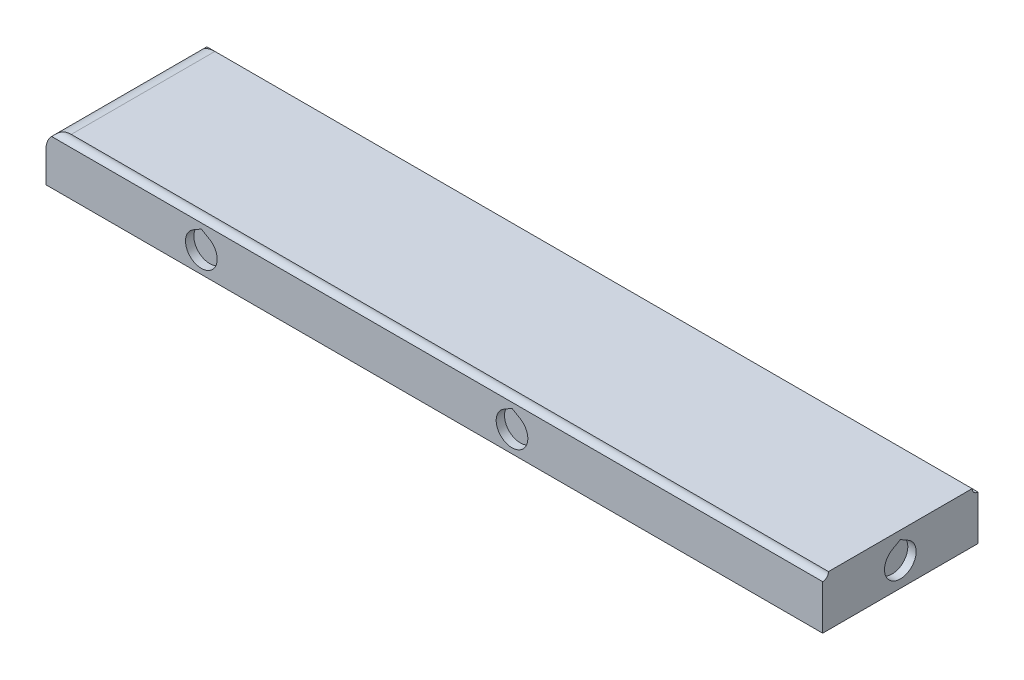
ISO-10303-21;
HEADER;
FILE_DESCRIPTION(('STEP AP214'),'2;1');
FILE_NAME('part.step','',(''),(''),'','','');
FILE_SCHEMA(('AUTOMOTIVE_DESIGN { 1 0 10303 214 1 1 1 1 }'));
ENDSEC;
DATA;
#1=APPLICATION_CONTEXT('core data for automotive mechanical design processes');
#2=APPLICATION_PROTOCOL_DEFINITION('international standard','automotive_design',2000,#1);
#3=PRODUCT_CONTEXT('',#1,'mechanical');
#4=PRODUCT('Part','Part','',(#3));
#5=PRODUCT_RELATED_PRODUCT_CATEGORY('part','',(#4));
#6=PRODUCT_DEFINITION_FORMATION('','',#4);
#7=PRODUCT_DEFINITION_CONTEXT('part definition',#1,'design');
#8=PRODUCT_DEFINITION('design','',#6,#7);
#9=PRODUCT_DEFINITION_SHAPE('','',#8);
#10=(LENGTH_UNIT() NAMED_UNIT(*) SI_UNIT(.MILLI.,.METRE.));
#11=(NAMED_UNIT(*) PLANE_ANGLE_UNIT() SI_UNIT($,.RADIAN.));
#12=(NAMED_UNIT(*) SI_UNIT($,.STERADIAN.) SOLID_ANGLE_UNIT());
#13=UNCERTAINTY_MEASURE_WITH_UNIT(LENGTH_MEASURE(1.E-05),#10,'distance_accuracy_value','');
#14=(GEOMETRIC_REPRESENTATION_CONTEXT(3) GLOBAL_UNCERTAINTY_ASSIGNED_CONTEXT((#13)) GLOBAL_UNIT_ASSIGNED_CONTEXT((#10,
#11,#12)) REPRESENTATION_CONTEXT('',''));
#15=CARTESIAN_POINT('',(0.,0.,0.));
#16=DIRECTION('',(0.,0.,1.));
#17=DIRECTION('',(1.,0.,0.));
#18=AXIS2_PLACEMENT_3D('',#15,#16,#17);
#19=CARTESIAN_POINT('',(100.,-13.,20.));
#20=DIRECTION('',(1.,0.,0.));
#21=DIRECTION('',(0.,0.,-1.));
#22=AXIS2_PLACEMENT_3D('',#19,#20,#21);
#23=PLANE('',#22);
#24=DIRECTION('',(0.,1.,0.));
#25=VECTOR('',#24,1.);
#26=CARTESIAN_POINT('',(100.,-13.,-20.));
#27=LINE('',#26,#25);
#28=CARTESIAN_POINT('',(100.,-13.,-20.));
#29=VERTEX_POINT('',#28);
#30=CARTESIAN_POINT('',(100.,-1.5,-20.));
#31=VERTEX_POINT('',#30);
#32=EDGE_CURVE('E342',#29,#31,#27,.T.);
#33=ORIENTED_EDGE('',*,*,#32,.T.);
#34=CARTESIAN_POINT('',(100.,0.,-20.));
#35=DIRECTION('',(1.,0.,0.));
#36=DIRECTION('',(0.,0.,-1.));
#37=AXIS2_PLACEMENT_3D('',#34,#35,#36);
#38=CIRCLE('',#37,1.5);
#39=CARTESIAN_POINT('',(100.,0.,-18.5));
#40=VERTEX_POINT('',#39);
#41=EDGE_CURVE('E309',#31,#40,#38,.F.);
#42=ORIENTED_EDGE('',*,*,#41,.T.);
#43=DIRECTION('',(0.,0.,-1.));
#44=VECTOR('',#43,1.);
#45=CARTESIAN_POINT('',(100.,0.,20.));
#46=LINE('',#45,#44);
#47=CARTESIAN_POINT('',(100.,0.,18.5));
#48=VERTEX_POINT('',#47);
#49=EDGE_CURVE('E323',#48,#40,#46,.T.);
#50=ORIENTED_EDGE('',*,*,#49,.F.);
#51=CARTESIAN_POINT('',(100.,0.,20.));
#52=DIRECTION('',(1.,0.,0.));
#53=DIRECTION('',(0.,0.,-1.));
#54=AXIS2_PLACEMENT_3D('',#51,#52,#53);
#55=CIRCLE('',#54,1.5);
#56=CARTESIAN_POINT('',(100.,-1.5,20.));
#57=VERTEX_POINT('',#56);
#58=EDGE_CURVE('E318',#48,#57,#55,.F.);
#59=ORIENTED_EDGE('',*,*,#58,.T.);
#60=DIRECTION('',(0.,1.,0.));
#61=VECTOR('',#60,1.);
#62=CARTESIAN_POINT('',(100.,-13.,20.));
#63=LINE('',#62,#61);
#64=CARTESIAN_POINT('',(100.,-13.,20.));
#65=VERTEX_POINT('',#64);
#66=EDGE_CURVE('E345',#65,#57,#63,.T.);
#67=ORIENTED_EDGE('',*,*,#66,.F.);
#68=DIRECTION('',(0.,0.,-1.));
#69=VECTOR('',#68,1.);
#70=CARTESIAN_POINT('',(100.,-13.,20.));
#71=LINE('',#70,#69);
#72=EDGE_CURVE('E330',#65,#29,#71,.T.);
#73=ORIENTED_EDGE('',*,*,#72,.T.);
#74=EDGE_LOOP('',(#33,#42,#50,#59,#67,#73));
#75=FACE_BOUND('',#74,.T.);
#76=DIRECTION('',(0.,-0.499999999999997,-0.86602540378444));
#77=VECTOR('',#76,1.);
#78=CARTESIAN_POINT('',(100.,-1.58234823978922,0.913569182194027));
#79=LINE('',#78,#77);
#80=CARTESIAN_POINT('',(100.,-2.10979765305228,0.));
#81=VERTEX_POINT('',#80);
#82=CARTESIAN_POINT('',(100.,-3.28614882652613,-2.03749999999999));
#83=VERTEX_POINT('',#82);
#84=EDGE_CURVE('E216',#81,#83,#79,.T.);
#85=ORIENTED_EDGE('',*,*,#84,.T.);
#86=CARTESIAN_POINT('',(100.,-6.81520234694772,0.));
#87=DIRECTION('',(1.,0.,0.));
#88=DIRECTION('',(0.,0.,-1.));
#89=AXIS2_PLACEMENT_3D('',#86,#87,#88);
#90=CIRCLE('',#89,4.075);
#91=CARTESIAN_POINT('',(100.,-3.28614882652613,2.03749999999999));
#92=VERTEX_POINT('',#91);
#93=EDGE_CURVE('E210',#83,#92,#90,.F.);
#94=ORIENTED_EDGE('',*,*,#93,.T.);
#95=DIRECTION('',(0.,-0.499999999999998,0.86602540378444));
#96=VECTOR('',#95,1.);
#97=CARTESIAN_POINT('',(100.,-1.58234823978921,-0.913569182194028));
#98=LINE('',#97,#96);
#99=EDGE_CURVE('E213',#81,#92,#98,.T.);
#100=ORIENTED_EDGE('',*,*,#99,.F.);
#101=EDGE_LOOP('',(#85,#94,#100));
#102=FACE_BOUND('',#101,.T.);
#103=ADVANCED_FACE('F37',(#75,#102),#23,.T.);
#104=CARTESIAN_POINT('',(-100.,-13.,20.));
#105=DIRECTION('',(-1.,0.,0.));
#106=DIRECTION('',(0.,0.,1.));
#107=AXIS2_PLACEMENT_3D('',#104,#105,#106);
#108=PLANE('',#107);
#109=DIRECTION('',(0.,1.,0.));
#110=VECTOR('',#109,1.);
#111=CARTESIAN_POINT('',(-100.,-13.,20.));
#112=LINE('',#111,#110);
#113=CARTESIAN_POINT('',(-100.,-13.,20.));
#114=VERTEX_POINT('',#113);
#115=CARTESIAN_POINT('',(-100.,-5.,20.));
#116=VERTEX_POINT('',#115);
#117=EDGE_CURVE('E336',#114,#116,#112,.T.);
#118=ORIENTED_EDGE('',*,*,#117,.T.);
#119=DIRECTION('',(0.,0.,1.));
#120=VECTOR('',#119,1.);
#121=CARTESIAN_POINT('',(-100.,-5.,-18.5));
#122=LINE('',#121,#120);
#123=CARTESIAN_POINT('',(-100.,-5.,-20.));
#124=VERTEX_POINT('',#123);
#125=EDGE_CURVE('E65',#116,#124,#122,.F.);
#126=ORIENTED_EDGE('',*,*,#125,.T.);
#127=DIRECTION('',(0.,1.,0.));
#128=VECTOR('',#127,1.);
#129=CARTESIAN_POINT('',(-100.,-13.,-20.));
#130=LINE('',#129,#128);
#131=CARTESIAN_POINT('',(-100.,-13.,-20.));
#132=VERTEX_POINT('',#131);
#133=EDGE_CURVE('E339',#132,#124,#130,.T.);
#134=ORIENTED_EDGE('',*,*,#133,.F.);
#135=DIRECTION('',(0.,0.,1.));
#136=VECTOR('',#135,1.);
#137=CARTESIAN_POINT('',(-100.,-13.,20.));
#138=LINE('',#137,#136);
#139=EDGE_CURVE('E324',#132,#114,#138,.T.);
#140=ORIENTED_EDGE('',*,*,#139,.T.);
#141=EDGE_LOOP('',(#118,#126,#134,#140));
#142=FACE_BOUND('',#141,.T.);
#143=ADVANCED_FACE('F385',(#142),#108,.T.);
#144=CARTESIAN_POINT('',(-100.,-13.,-20.));
#145=DIRECTION('',(0.,0.,-1.));
#146=DIRECTION('',(-1.,0.,0.));
#147=AXIS2_PLACEMENT_3D('',#144,#145,#146);
#148=PLANE('',#147);
#149=CARTESIAN_POINT('',(-20.,-7.56520234694773,-20.));
#150=DIRECTION('',(0.,0.,-1.));
#151=DIRECTION('',(-1.,0.,0.));
#152=AXIS2_PLACEMENT_3D('',#149,#150,#151);
#153=CIRCLE('',#152,4.075);
#154=CARTESIAN_POINT('',(-17.9625,-4.03614882652614,-20.));
#155=VERTEX_POINT('',#154);
#156=CARTESIAN_POINT('',(-22.0375,-4.03614882652612,-20.));
#157=VERTEX_POINT('',#156);
#158=EDGE_CURVE('E245',#155,#157,#153,.T.);
#159=ORIENTED_EDGE('',*,*,#158,.F.);
#160=DIRECTION('',(-0.86602540378444,0.499999999999999,0.));
#161=VECTOR('',#160,1.);
#162=CARTESIAN_POINT('',(-66.2383287086133,23.8359138737439,-20.));
#163=LINE('',#162,#161);
#164=CARTESIAN_POINT('',(-20.,-2.85979765305229,-20.));
#165=VERTEX_POINT('',#164);
#166=EDGE_CURVE('E274',#155,#165,#163,.T.);
#167=ORIENTED_EDGE('',*,*,#166,.T.);
#168=DIRECTION('',(-0.866025403784441,-0.499999999999997,0.));
#169=VECTOR('',#168,1.);
#170=CARTESIAN_POINT('',(-63.761671291387,-28.1256103533223,-20.));
#171=LINE('',#170,#169);
#172=EDGE_CURVE('E280',#165,#157,#171,.T.);
#173=ORIENTED_EDGE('',*,*,#172,.T.);
#174=EDGE_LOOP('',(#159,#167,#173));
#175=FACE_BOUND('',#174,.T.);
#176=CARTESIAN_POINT('',(60.,-7.56520234694773,-20.));
#177=DIRECTION('',(0.,0.,-1.));
#178=DIRECTION('',(-1.,0.,0.));
#179=AXIS2_PLACEMENT_3D('',#176,#177,#178);
#180=CIRCLE('',#179,4.075);
#181=CARTESIAN_POINT('',(62.0375,-4.03614882652614,-20.));
#182=VERTEX_POINT('',#181);
#183=CARTESIAN_POINT('',(57.9625,-4.03614882652613,-20.));
#184=VERTEX_POINT('',#183);
#185=EDGE_CURVE('E287',#182,#184,#180,.T.);
#186=ORIENTED_EDGE('',*,*,#185,.F.);
#187=DIRECTION('',(-0.86602540378444,0.499999999999999,0.));
#188=VECTOR('',#187,1.);
#189=CARTESIAN_POINT('',(13.7616712913867,23.8359138737439,-20.));
#190=LINE('',#189,#188);
#191=CARTESIAN_POINT('',(60.,-2.85979765305229,-20.));
#192=VERTEX_POINT('',#191);
#193=EDGE_CURVE('E296',#182,#192,#190,.T.);
#194=ORIENTED_EDGE('',*,*,#193,.T.);
#195=DIRECTION('',(-0.866025403784441,-0.499999999999997,0.));
#196=VECTOR('',#195,1.);
#197=CARTESIAN_POINT('',(16.238328708613,-28.1256103533223,-20.));
#198=LINE('',#197,#196);
#199=EDGE_CURVE('E302',#192,#184,#198,.T.);
#200=ORIENTED_EDGE('',*,*,#199,.T.);
#201=EDGE_LOOP('',(#186,#194,#200));
#202=FACE_BOUND('',#201,.T.);
#203=ORIENTED_EDGE('',*,*,#133,.T.);
#204=CARTESIAN_POINT('',(-95.,-5.,-20.));
#205=DIRECTION('',(0.,0.,-1.));
#206=DIRECTION('',(-1.,0.,0.));
#207=AXIS2_PLACEMENT_3D('',#204,#205,#206);
#208=CIRCLE('',#207,5.);
#209=CARTESIAN_POINT('',(-98.5707142142714,-1.5,-20.));
#210=VERTEX_POINT('',#209);
#211=EDGE_CURVE('E51',#124,#210,#208,.T.);
#212=ORIENTED_EDGE('',*,*,#211,.T.);
#213=DIRECTION('',(-1.,0.,0.));
#214=VECTOR('',#213,1.);
#215=CARTESIAN_POINT('',(104.,-1.5,-20.));
#216=LINE('',#215,#214);
#217=EDGE_CURVE('E316',#31,#210,#216,.T.);
#218=ORIENTED_EDGE('',*,*,#217,.F.);
#219=ORIENTED_EDGE('',*,*,#32,.F.);
#220=DIRECTION('',(-1.,0.,0.));
#221=VECTOR('',#220,1.);
#222=CARTESIAN_POINT('',(-100.,-13.,-20.));
#223=LINE('',#222,#221);
#224=EDGE_CURVE('E333',#29,#132,#223,.T.);
#225=ORIENTED_EDGE('',*,*,#224,.T.);
#226=EDGE_LOOP('',(#203,#212,#218,#219,#225));
#227=FACE_BOUND('',#226,.T.);
#228=ADVANCED_FACE('F382',(#175,#202,#227),#148,.T.);
#229=CARTESIAN_POINT('',(-100.,-13.,20.));
#230=DIRECTION('',(0.,0.,1.));
#231=DIRECTION('',(1.,0.,0.));
#232=AXIS2_PLACEMENT_3D('',#229,#230,#231);
#233=PLANE('',#232);
#234=CARTESIAN_POINT('',(-60.,-7.56520234694773,20.));
#235=DIRECTION('',(0.,0.,1.));
#236=DIRECTION('',(1.,0.,0.));
#237=AXIS2_PLACEMENT_3D('',#234,#235,#236);
#238=CIRCLE('',#237,4.075);
#239=CARTESIAN_POINT('',(-62.0375,-4.03614882652614,20.));
#240=VERTEX_POINT('',#239);
#241=CARTESIAN_POINT('',(-57.9625,-4.03614882652613,20.));
#242=VERTEX_POINT('',#241);
#243=EDGE_CURVE('E235',#240,#242,#238,.T.);
#244=ORIENTED_EDGE('',*,*,#243,.F.);
#245=DIRECTION('',(0.86602540378444,0.499999999999999,0.));
#246=VECTOR('',#245,1.);
#247=CARTESIAN_POINT('',(-13.7616712913867,23.8359138737439,20.));
#248=LINE('',#247,#246);
#249=CARTESIAN_POINT('',(-60.,-2.85979765305229,20.));
#250=VERTEX_POINT('',#249);
#251=EDGE_CURVE('E230',#240,#250,#248,.T.);
#252=ORIENTED_EDGE('',*,*,#251,.T.);
#253=DIRECTION('',(0.866025403784441,-0.499999999999997,0.));
#254=VECTOR('',#253,1.);
#255=CARTESIAN_POINT('',(-16.238328708613,-28.1256103533223,20.));
#256=LINE('',#255,#254);
#257=EDGE_CURVE('E237',#250,#242,#256,.T.);
#258=ORIENTED_EDGE('',*,*,#257,.T.);
#259=EDGE_LOOP('',(#244,#252,#258));
#260=FACE_BOUND('',#259,.T.);
#261=CARTESIAN_POINT('',(20.,-7.56520234694773,20.));
#262=DIRECTION('',(0.,0.,1.));
#263=DIRECTION('',(1.,0.,0.));
#264=AXIS2_PLACEMENT_3D('',#261,#262,#263);
#265=CIRCLE('',#264,4.075);
#266=CARTESIAN_POINT('',(17.9625,-4.03614882652614,20.));
#267=VERTEX_POINT('',#266);
#268=CARTESIAN_POINT('',(22.0375,-4.03614882652614,20.));
#269=VERTEX_POINT('',#268);
#270=EDGE_CURVE('E224',#267,#269,#265,.T.);
#271=ORIENTED_EDGE('',*,*,#270,.F.);
#272=DIRECTION('',(0.86602540378444,0.499999999999999,0.));
#273=VECTOR('',#272,1.);
#274=CARTESIAN_POINT('',(66.2383287086133,23.8359138737439,20.));
#275=LINE('',#274,#273);
#276=CARTESIAN_POINT('',(20.,-2.85979765305229,20.));
#277=VERTEX_POINT('',#276);
#278=EDGE_CURVE('E254',#267,#277,#275,.T.);
#279=ORIENTED_EDGE('',*,*,#278,.T.);
#280=DIRECTION('',(0.866025403784441,-0.499999999999997,0.));
#281=VECTOR('',#280,1.);
#282=CARTESIAN_POINT('',(63.761671291387,-28.1256103533223,20.));
#283=LINE('',#282,#281);
#284=EDGE_CURVE('E260',#277,#269,#283,.T.);
#285=ORIENTED_EDGE('',*,*,#284,.T.);
#286=EDGE_LOOP('',(#271,#279,#285));
#287=FACE_BOUND('',#286,.T.);
#288=DIRECTION('',(1.,0.,0.));
#289=VECTOR('',#288,1.);
#290=CARTESIAN_POINT('',(-105.,-1.5,20.));
#291=LINE('',#290,#289);
#292=CARTESIAN_POINT('',(-98.5707142142714,-1.5,20.));
#293=VERTEX_POINT('',#292);
#294=EDGE_CURVE('E321',#293,#57,#291,.T.);
#295=ORIENTED_EDGE('',*,*,#294,.F.);
#296=CARTESIAN_POINT('',(-95.,-5.,20.));
#297=DIRECTION('',(0.,0.,1.));
#298=DIRECTION('',(1.,0.,0.));
#299=AXIS2_PLACEMENT_3D('',#296,#297,#298);
#300=CIRCLE('',#299,5.);
#301=EDGE_CURVE('E363',#293,#116,#300,.T.);
#302=ORIENTED_EDGE('',*,*,#301,.T.);
#303=ORIENTED_EDGE('',*,*,#117,.F.);
#304=DIRECTION('',(1.,0.,0.));
#305=VECTOR('',#304,1.);
#306=CARTESIAN_POINT('',(-100.,-13.,20.));
#307=LINE('',#306,#305);
#308=EDGE_CURVE('E327',#114,#65,#307,.T.);
#309=ORIENTED_EDGE('',*,*,#308,.T.);
#310=ORIENTED_EDGE('',*,*,#66,.T.);
#311=EDGE_LOOP('',(#295,#302,#303,#309,#310));
#312=FACE_BOUND('',#311,.T.);
#313=ADVANCED_FACE('F377',(#260,#287,#312),#233,.T.);
#314=CARTESIAN_POINT('',(0.,-13.,0.));
#315=DIRECTION('',(0.,-1.,0.));
#316=DIRECTION('',(0.,0.,-1.));
#317=AXIS2_PLACEMENT_3D('',#314,#315,#316);
#318=PLANE('',#317);
#319=ORIENTED_EDGE('',*,*,#139,.F.);
#320=ORIENTED_EDGE('',*,*,#224,.F.);
#321=ORIENTED_EDGE('',*,*,#72,.F.);
#322=ORIENTED_EDGE('',*,*,#308,.F.);
#323=EDGE_LOOP('',(#319,#320,#321,#322));
#324=FACE_BOUND('',#323,.T.);
#325=ADVANCED_FACE('F374',(#324),#318,.T.);
#326=CARTESIAN_POINT('',(0.,0.,0.));
#327=DIRECTION('',(0.,-1.,0.));
#328=DIRECTION('',(0.,0.,-1.));
#329=AXIS2_PLACEMENT_3D('',#326,#327,#328);
#330=PLANE('',#329);
#331=DIRECTION('',(-1.,0.,0.));
#332=VECTOR('',#331,1.);
#333=CARTESIAN_POINT('',(104.,0.,-18.5));
#334=LINE('',#333,#332);
#335=CARTESIAN_POINT('',(-95.,0.,-18.5));
#336=VERTEX_POINT('',#335);
#337=EDGE_CURVE('E350',#40,#336,#334,.T.);
#338=ORIENTED_EDGE('',*,*,#337,.T.);
#339=DIRECTION('',(0.,0.,1.));
#340=VECTOR('',#339,1.);
#341=CARTESIAN_POINT('',(-95.,0.,18.5));
#342=LINE('',#341,#340);
#343=CARTESIAN_POINT('',(-95.,0.,18.5));
#344=VERTEX_POINT('',#343);
#345=EDGE_CURVE('E353',#336,#344,#342,.T.);
#346=ORIENTED_EDGE('',*,*,#345,.T.);
#347=DIRECTION('',(1.,0.,0.));
#348=VECTOR('',#347,1.);
#349=CARTESIAN_POINT('',(-105.,0.,18.5));
#350=LINE('',#349,#348);
#351=EDGE_CURVE('E341',#344,#48,#350,.T.);
#352=ORIENTED_EDGE('',*,*,#351,.T.);
#353=ORIENTED_EDGE('',*,*,#49,.T.);
#354=EDGE_LOOP('',(#338,#346,#352,#353));
#355=FACE_BOUND('',#354,.T.);
#356=ADVANCED_FACE('F370',(#355),#330,.F.);
#357=CARTESIAN_POINT('',(-105.,0.,20.));
#358=DIRECTION('',(1.,0.,0.));
#359=DIRECTION('',(0.,0.,-1.));
#360=AXIS2_PLACEMENT_3D('',#357,#358,#359);
#361=CYLINDRICAL_SURFACE('',#360,1.5);
#362=ORIENTED_EDGE('',*,*,#351,.F.);
#363=CARTESIAN_POINT('',(-95.,0.,18.5));
#364=CARTESIAN_POINT('',(-95.0632074085711,-7.37248388473627E-08,18.5000045422502));
#365=CARTESIAN_POINT('',(-95.1264084863775,-0.00119871710108787,18.4999994035173));
#366=CARTESIAN_POINT('',(-95.2527201232262,-0.00599079248176303,18.5000092113192));
#367=CARTESIAN_POINT('',(-95.3158306817753,-0.00958423748858772,18.5000241579632));
#368=CARTESIAN_POINT('',(-95.5049601896881,-0.0239571376603004,18.5001583343451));
#369=CARTESIAN_POINT('',(-95.6307252669942,-0.038329154865842,18.5003669612239));
#370=CARTESIAN_POINT('',(-95.8818211635778,-0.0767224642055888,18.5018399987264));
#371=CARTESIAN_POINT('',(-96.0071397520276,-0.100822715307072,18.5031131423363));
#372=CARTESIAN_POINT('',(-96.255494460267,-0.158515785992487,18.5081172879022));
#373=CARTESIAN_POINT('',(-96.3785315021862,-0.192104677343717,18.5118472735913));
#374=CARTESIAN_POINT('',(-96.5857041935321,-0.25725617881909,18.5219751760395));
#375=CARTESIAN_POINT('',(-96.6706275263764,-0.286503549802404,18.527264211637));
#376=CARTESIAN_POINT('',(-96.8385783977135,-0.349444240708836,18.5409154650748));
#377=CARTESIAN_POINT('',(-96.9216058389795,-0.383137788047014,18.5492778401508));
#378=CARTESIAN_POINT('',(-97.0850512236004,-0.454619075486954,18.5700688575194));
#379=CARTESIAN_POINT('',(-97.1654767737562,-0.492393147509898,18.5824841903225));
#380=CARTESIAN_POINT('',(-97.3233957600838,-0.571722823769972,18.6125813715547));
#381=CARTESIAN_POINT('',(-97.4008905096666,-0.613276704996269,18.6302608286268));
#382=CARTESIAN_POINT('',(-97.5741505288891,-0.712071329459267,18.6783360189993));
#383=CARTESIAN_POINT('',(-97.6687289013673,-0.770376637633927,18.7109296442741));
#384=CARTESIAN_POINT('',(-97.8496057588709,-0.890080045510637,18.7904940328188));
#385=CARTESIAN_POINT('',(-97.9359151115283,-0.95147391948709,18.8374455759759));
#386=CARTESIAN_POINT('',(-98.0764580865271,-1.05778064421383,18.9346970133523));
#387=CARTESIAN_POINT('',(-98.1332454639772,-1.10288757069419,18.9810598617135));
#388=CARTESIAN_POINT('',(-98.2387915631847,-1.19015815545114,19.0845303192187));
#389=CARTESIAN_POINT('',(-98.2875605280475,-1.23232552853754,19.1416240171538));
#390=CARTESIAN_POINT('',(-98.3667654407922,-1.3030871925744,19.2546675305288));
#391=CARTESIAN_POINT('',(-98.3989237297524,-1.33273462841028,19.3087448363696));
#392=CARTESIAN_POINT('',(-98.45570937716,-1.38619368040252,19.4234109837846));
#393=CARTESIAN_POINT('',(-98.4803402655582,-1.4100080309226,19.4839967551635));
#394=CARTESIAN_POINT('',(-98.518949332485,-1.44786670156913,19.6035334818617));
#395=CARTESIAN_POINT('',(-98.5337870291589,-1.46268522081036,19.6619621738375));
#396=CARTESIAN_POINT('',(-98.5562178232043,-1.48523486135282,19.7814704415024));
#397=CARTESIAN_POINT('',(-98.5638252070087,-1.492979957897,19.8425445392593));
#398=CARTESIAN_POINT('',(-98.5687039478111,-1.49795033923135,19.9199756235957));
#399=CARTESIAN_POINT('',(-98.5694580047009,-1.49871890988089,19.9359713570481));
#400=CARTESIAN_POINT('',(-98.5704624827036,-1.49974301366461,19.9679760702863));
#401=CARTESIAN_POINT('',(-98.5707134990357,-1.49999915312883,19.9839850119675));
#402=CARTESIAN_POINT('',(-98.5707142142719,-1.50000000000001,20.));
#403=B_SPLINE_CURVE_WITH_KNOTS('',3,(#363,#364,#365,#366,#367,#368,#369,#370,#371,#372,#373,
#374,#375,#376,#377,#378,#379,#380,#381,#382,#383,#384,#385,#386,#387,#388,#389,#390,#391,#392,
#393,#394,#395,#396,#397,#398,#399,#400,#401,#402),.UNSPECIFIED.,.F.,.F.,(4,2,2,2,2,2,2,2,2,2,2,
2,2,2,2,2,2,2,2,4),(0.,0.189598214355791,0.379197458129469,0.758550656017245,1.14104684502629,
1.52338491468795,1.79315013370935,2.06292915615761,2.33183101748516,2.6006109094602,
2.94701382208101,3.29295504014723,3.5502992926192,3.80731220309813,4.01513432589599,
4.22285884108397,4.40829200227504,4.593357998168,4.64144380374726,4.68947267845692),.UNSPECIFIED.);
#404=EDGE_CURVE('E356',#344,#293,#403,.T.);
#405=ORIENTED_EDGE('',*,*,#404,.T.);
#406=ORIENTED_EDGE('',*,*,#294,.T.);
#407=ORIENTED_EDGE('',*,*,#58,.F.);
#408=EDGE_LOOP('',(#362,#405,#406,#407));
#409=FACE_BOUND('',#408,.T.);
#410=ADVANCED_FACE('F365',(#409),#361,.F.);
#411=CARTESIAN_POINT('',(104.,0.,-20.));
#412=DIRECTION('',(-1.,0.,0.));
#413=DIRECTION('',(0.,0.,1.));
#414=AXIS2_PLACEMENT_3D('',#411,#412,#413);
#415=CYLINDRICAL_SURFACE('',#414,1.5);
#416=ORIENTED_EDGE('',*,*,#217,.T.);
#417=CARTESIAN_POINT('',(-98.5707142142714,-1.5,-20.));
#418=CARTESIAN_POINT('',(-98.5707146316537,-1.50000354322243,-19.9674458749782));
#419=CARTESIAN_POINT('',(-98.5696747025049,-1.49893919281649,-19.9349099277051));
#420=CARTESIAN_POINT('',(-98.5655315316107,-1.49471853725899,-19.8701198276989));
#421=CARTESIAN_POINT('',(-98.562429167018,-1.49156312143813,-19.8378655610728));
#422=CARTESIAN_POINT('',(-98.5501075462765,-1.47907971290974,-19.7422736538211));
#423=CARTESIAN_POINT('',(-98.5378731443232,-1.46673328452275,-19.6796716392255));
#424=CARTESIAN_POINT('',(-98.5058146940188,-1.434924538676,-19.5585003906735));
#425=CARTESIAN_POINT('',(-98.4859994756675,-1.41547050121502,-19.4999265580568));
#426=CARTESIAN_POINT('',(-98.4394397089696,-1.37077235750755,-19.3879355286248));
#427=CARTESIAN_POINT('',(-98.4126880227985,-1.34552229006851,-19.3345237218618));
#428=CARTESIAN_POINT('',(-98.3516816541414,-1.28947223420928,-19.2313175022428));
#429=CARTESIAN_POINT('',(-98.3171344315356,-1.25846781797216,-19.1818093551791));
#430=CARTESIAN_POINT('',(-98.2423324410969,-1.19345995380745,-19.0895928875297));
#431=CARTESIAN_POINT('',(-98.2020753405626,-1.15945528231849,-19.0468873612864));
#432=CARTESIAN_POINT('',(-98.0910168665994,-1.06892689650908,-18.9443019461475));
#433=CARTESIAN_POINT('',(-98.0164311739685,-1.0111845300828,-18.8895864659665));
#434=CARTESIAN_POINT('',(-97.8580812302099,-0.896219824156282,-18.7948555515719));
#435=CARTESIAN_POINT('',(-97.7742947729637,-0.838999120499859,-18.7548767434955));
#436=CARTESIAN_POINT('',(-97.6187637659823,-0.739872832611739,-18.6941696994406));
#437=CARTESIAN_POINT('',(-97.5482944698984,-0.697316133312844,-18.6711513698435));
#438=CARTESIAN_POINT('',(-97.4040156153016,-0.615070568422077,-18.6311382770296));
#439=CARTESIAN_POINT('',(-97.3302040926943,-0.575383425679004,-18.6141471089312));
#440=CARTESIAN_POINT('',(-97.1797594039226,-0.499358632050628,-18.5849727565957));
#441=CARTESIAN_POINT('',(-97.1031201622875,-0.463028861021304,-18.5728006736769));
#442=CARTESIAN_POINT('',(-96.9476550582297,-0.394147717486031,-18.5522648379991));
#443=CARTESIAN_POINT('',(-96.8688285091383,-0.361597548536933,-18.543902295866));
#444=CARTESIAN_POINT('',(-96.6655781260325,-0.283715864906398,-18.5262725828024));
#445=CARTESIAN_POINT('',(-96.5398969995536,-0.241187694164266,-18.5190327275353));
#446=CARTESIAN_POINT('',(-96.2853543144397,-0.166213333802649,-18.5087585991027));
#447=CARTESIAN_POINT('',(-96.1564908337172,-0.133773406438603,-18.5057269341348));
#448=CARTESIAN_POINT('',(-95.8967850942319,-0.0792935698883184,-18.5018488869296));
#449=CARTESIAN_POINT('',(-95.7659464820667,-0.0572364572866331,-18.5009988793952));
#450=CARTESIAN_POINT('',(-95.5030006390009,-0.0236016214730041,-18.5000904514907));
#451=CARTESIAN_POINT('',(-95.3708943552808,-0.0120166092307552,-18.5000314801292));
#452=CARTESIAN_POINT('',(-95.1988194473382,-0.00379572318721024,-18.5000046012907));
#453=CARTESIAN_POINT('',(-95.1590426678713,-0.00237151038117975,-18.5000018490975));
#454=CARTESIAN_POINT('',(-95.079511785025,-0.000474305674378232,-18.4999995005877));
#455=CARTESIAN_POINT('',(-95.0397577074657,-2.31553577311442E-07,-18.4999999006781));
#456=CARTESIAN_POINT('',(-95.,0.,-18.5));
#457=B_SPLINE_CURVE_WITH_KNOTS('',3,(#417,#418,#419,#420,#421,#422,#423,#424,#425,#426,#427,
#428,#429,#430,#431,#432,#433,#434,#435,#436,#437,#438,#439,#440,#441,#442,#443,#444,#445,#446,
#447,#448,#449,#450,#451,#452,#453,#454,#455,#456),.UNSPECIFIED.,.F.,.F.,(4,2,2,2,2,2,2,2,2,2,2,
2,2,2,2,2,2,2,2,4),(0.,0.0975931978279523,0.195144915856671,0.388961644102889,0.582553302037791,
0.776344967449972,0.979205792270641,1.18214973342209,1.50742414005241,1.83350160965302,
2.0895917331533,2.34583435501922,2.60266387380856,2.85957495306652,3.25763812712903,
3.6559479070883,4.05359537915149,4.45096585794323,4.57036496856439,4.68962800461678),.UNSPECIFIED.);
#458=EDGE_CURVE('E11',#210,#336,#457,.T.);
#459=ORIENTED_EDGE('',*,*,#458,.T.);
#460=ORIENTED_EDGE('',*,*,#337,.F.);
#461=ORIENTED_EDGE('',*,*,#41,.F.);
#462=EDGE_LOOP('',(#416,#459,#460,#461));
#463=FACE_BOUND('',#462,.T.);
#464=ADVANCED_FACE('F369',(#463),#415,.F.);
#465=CARTESIAN_POINT('',(60.,-7.56520234694773,-17.85));
#466=DIRECTION('',(0.,0.,-1.));
#467=DIRECTION('',(-1.,0.,0.));
#468=AXIS2_PLACEMENT_3D('',#465,#466,#467);
#469=CYLINDRICAL_SURFACE('',#468,4.075);
#470=ORIENTED_EDGE('',*,*,#185,.T.);
#471=DIRECTION('',(0.,0.,-1.));
#472=VECTOR('',#471,1.);
#473=CARTESIAN_POINT('',(57.9625,-4.03614882652613,-17.85));
#474=LINE('',#473,#472);
#475=CARTESIAN_POINT('',(57.9625,-4.03614882652613,-17.85));
#476=VERTEX_POINT('',#475);
#477=EDGE_CURVE('E300',#476,#184,#474,.T.);
#478=ORIENTED_EDGE('',*,*,#477,.F.);
#479=CARTESIAN_POINT('',(60.,-7.56520234694773,-17.85));
#480=DIRECTION('',(0.,0.,-1.));
#481=DIRECTION('',(-1.,0.,0.));
#482=AXIS2_PLACEMENT_3D('',#479,#480,#481);
#483=CIRCLE('',#482,4.075);
#484=CARTESIAN_POINT('',(62.0375,-4.03614882652614,-17.85));
#485=VERTEX_POINT('',#484);
#486=EDGE_CURVE('E292',#485,#476,#483,.T.);
#487=ORIENTED_EDGE('',*,*,#486,.F.);
#488=DIRECTION('',(0.,0.,-1.));
#489=VECTOR('',#488,1.);
#490=CARTESIAN_POINT('',(62.0375,-4.03614882652614,-17.85));
#491=LINE('',#490,#489);
#492=EDGE_CURVE('E307',#485,#182,#491,.T.);
#493=ORIENTED_EDGE('',*,*,#492,.T.);
#494=EDGE_LOOP('',(#470,#478,#487,#493));
#495=FACE_BOUND('',#494,.T.);
#496=ADVANCED_FACE('F411',(#495),#469,.F.);
#497=CARTESIAN_POINT('',(13.7616712913867,23.8359138737439,-17.85));
#498=DIRECTION('',(-0.499999999999999,-0.866025403784439,0.));
#499=DIRECTION('',(0.866025403784439,-0.499999999999999,0.));
#500=AXIS2_PLACEMENT_3D('',#497,#498,#499);
#501=PLANE('',#500);
#502=ORIENTED_EDGE('',*,*,#193,.F.);
#503=ORIENTED_EDGE('',*,*,#492,.F.);
#504=DIRECTION('',(-0.86602540378444,0.499999999999999,0.));
#505=VECTOR('',#504,1.);
#506=CARTESIAN_POINT('',(13.7616712913867,23.8359138737439,-17.85));
#507=LINE('',#506,#505);
#508=CARTESIAN_POINT('',(60.,-2.85979765305229,-17.85));
#509=VERTEX_POINT('',#508);
#510=EDGE_CURVE('E298',#485,#509,#507,.T.);
#511=ORIENTED_EDGE('',*,*,#510,.T.);
#512=DIRECTION('',(0.,0.,-1.));
#513=VECTOR('',#512,1.);
#514=CARTESIAN_POINT('',(60.,-2.85979765305229,-17.85));
#515=LINE('',#514,#513);
#516=EDGE_CURVE('E310',#509,#192,#515,.T.);
#517=ORIENTED_EDGE('',*,*,#516,.T.);
#518=EDGE_LOOP('',(#502,#503,#511,#517));
#519=FACE_BOUND('',#518,.T.);
#520=ADVANCED_FACE('F415',(#519),#501,.T.);
#521=CARTESIAN_POINT('',(16.238328708613,-28.1256103533223,-17.85));
#522=DIRECTION('',(0.499999999999997,-0.86602540378444,0.));
#523=DIRECTION('',(0.866025403784441,0.499999999999997,0.));
#524=AXIS2_PLACEMENT_3D('',#521,#522,#523);
#525=PLANE('',#524);
#526=ORIENTED_EDGE('',*,*,#199,.F.);
#527=ORIENTED_EDGE('',*,*,#516,.F.);
#528=DIRECTION('',(-0.866025403784441,-0.499999999999997,0.));
#529=VECTOR('',#528,1.);
#530=CARTESIAN_POINT('',(16.238328708613,-28.1256103533223,-17.85));
#531=LINE('',#530,#529);
#532=EDGE_CURVE('E295',#509,#476,#531,.T.);
#533=ORIENTED_EDGE('',*,*,#532,.T.);
#534=ORIENTED_EDGE('',*,*,#477,.T.);
#535=EDGE_LOOP('',(#526,#527,#533,#534));
#536=FACE_BOUND('',#535,.T.);
#537=ADVANCED_FACE('F420',(#536),#525,.T.);
#538=CARTESIAN_POINT('',(0.,0.,-17.85));
#539=DIRECTION('',(0.,0.,-1.));
#540=DIRECTION('',(-1.,0.,0.));
#541=AXIS2_PLACEMENT_3D('',#538,#539,#540);
#542=PLANE('',#541);
#543=ORIENTED_EDGE('',*,*,#486,.T.);
#544=ORIENTED_EDGE('',*,*,#532,.F.);
#545=ORIENTED_EDGE('',*,*,#510,.F.);
#546=EDGE_LOOP('',(#543,#544,#545));
#547=FACE_BOUND('',#546,.T.);
#548=ADVANCED_FACE('F425',(#547),#542,.T.);
#549=CARTESIAN_POINT('',(-20.,-7.56520234694773,-17.85));
#550=DIRECTION('',(0.,0.,-1.));
#551=DIRECTION('',(-1.,0.,0.));
#552=AXIS2_PLACEMENT_3D('',#549,#550,#551);
#553=CYLINDRICAL_SURFACE('',#552,4.075);
#554=ORIENTED_EDGE('',*,*,#158,.T.);
#555=DIRECTION('',(0.,0.,-1.));
#556=VECTOR('',#555,1.);
#557=CARTESIAN_POINT('',(-22.0375,-4.03614882652613,-17.85));
#558=LINE('',#557,#556);
#559=CARTESIAN_POINT('',(-22.0375,-4.03614882652613,-17.85));
#560=VERTEX_POINT('',#559);
#561=EDGE_CURVE('E278',#560,#157,#558,.T.);
#562=ORIENTED_EDGE('',*,*,#561,.F.);
#563=CARTESIAN_POINT('',(-20.,-7.56520234694773,-17.85));
#564=DIRECTION('',(0.,0.,-1.));
#565=DIRECTION('',(-1.,0.,0.));
#566=AXIS2_PLACEMENT_3D('',#563,#564,#565);
#567=CIRCLE('',#566,4.075);
#568=CARTESIAN_POINT('',(-17.9625,-4.03614882652614,-17.85));
#569=VERTEX_POINT('',#568);
#570=EDGE_CURVE('E270',#569,#560,#567,.T.);
#571=ORIENTED_EDGE('',*,*,#570,.F.);
#572=DIRECTION('',(0.,0.,-1.));
#573=VECTOR('',#572,1.);
#574=CARTESIAN_POINT('',(-17.9625,-4.03614882652614,-17.85));
#575=LINE('',#574,#573);
#576=EDGE_CURVE('E285',#569,#155,#575,.T.);
#577=ORIENTED_EDGE('',*,*,#576,.T.);
#578=EDGE_LOOP('',(#554,#562,#571,#577));
#579=FACE_BOUND('',#578,.T.);
#580=ADVANCED_FACE('F430',(#579),#553,.F.);
#581=CARTESIAN_POINT('',(-66.2383287086133,23.8359138737439,-17.85));
#582=DIRECTION('',(-0.499999999999999,-0.866025403784439,0.));
#583=DIRECTION('',(0.866025403784439,-0.499999999999999,0.));
#584=AXIS2_PLACEMENT_3D('',#581,#582,#583);
#585=PLANE('',#584);
#586=ORIENTED_EDGE('',*,*,#166,.F.);
#587=ORIENTED_EDGE('',*,*,#576,.F.);
#588=DIRECTION('',(-0.86602540378444,0.499999999999999,0.));
#589=VECTOR('',#588,1.);
#590=CARTESIAN_POINT('',(-66.2383287086133,23.8359138737439,-17.85));
#591=LINE('',#590,#589);
#592=CARTESIAN_POINT('',(-20.,-2.85979765305229,-17.85));
#593=VERTEX_POINT('',#592);
#594=EDGE_CURVE('E276',#569,#593,#591,.T.);
#595=ORIENTED_EDGE('',*,*,#594,.T.);
#596=DIRECTION('',(0.,0.,-1.));
#597=VECTOR('',#596,1.);
#598=CARTESIAN_POINT('',(-20.,-2.85979765305229,-17.85));
#599=LINE('',#598,#597);
#600=EDGE_CURVE('E288',#593,#165,#599,.T.);
#601=ORIENTED_EDGE('',*,*,#600,.T.);
#602=EDGE_LOOP('',(#586,#587,#595,#601));
#603=FACE_BOUND('',#602,.T.);
#604=ADVANCED_FACE('F434',(#603),#585,.T.);
#605=CARTESIAN_POINT('',(-63.761671291387,-28.1256103533223,-17.85));
#606=DIRECTION('',(0.499999999999997,-0.86602540378444,0.));
#607=DIRECTION('',(0.866025403784441,0.499999999999997,0.));
#608=AXIS2_PLACEMENT_3D('',#605,#606,#607);
#609=PLANE('',#608);
#610=ORIENTED_EDGE('',*,*,#172,.F.);
#611=ORIENTED_EDGE('',*,*,#600,.F.);
#612=DIRECTION('',(-0.866025403784441,-0.499999999999997,0.));
#613=VECTOR('',#612,1.);
#614=CARTESIAN_POINT('',(-63.761671291387,-28.1256103533223,-17.85));
#615=LINE('',#614,#613);
#616=EDGE_CURVE('E273',#593,#560,#615,.T.);
#617=ORIENTED_EDGE('',*,*,#616,.T.);
#618=ORIENTED_EDGE('',*,*,#561,.T.);
#619=EDGE_LOOP('',(#610,#611,#617,#618));
#620=FACE_BOUND('',#619,.T.);
#621=ADVANCED_FACE('F436',(#620),#609,.T.);
#622=CARTESIAN_POINT('',(-80.,0.,-17.85));
#623=DIRECTION('',(0.,0.,-1.));
#624=DIRECTION('',(-1.,0.,0.));
#625=AXIS2_PLACEMENT_3D('',#622,#623,#624);
#626=PLANE('',#625);
#627=ORIENTED_EDGE('',*,*,#570,.T.);
#628=ORIENTED_EDGE('',*,*,#616,.F.);
#629=ORIENTED_EDGE('',*,*,#594,.F.);
#630=EDGE_LOOP('',(#627,#628,#629));
#631=FACE_BOUND('',#630,.T.);
#632=ADVANCED_FACE('F439',(#631),#626,.T.);
#633=CARTESIAN_POINT('',(20.,-7.56520234694773,17.85));
#634=DIRECTION('',(0.,0.,1.));
#635=DIRECTION('',(1.,0.,0.));
#636=AXIS2_PLACEMENT_3D('',#633,#634,#635);
#637=CYLINDRICAL_SURFACE('',#636,4.075);
#638=ORIENTED_EDGE('',*,*,#270,.T.);
#639=DIRECTION('',(0.,0.,1.));
#640=VECTOR('',#639,1.);
#641=CARTESIAN_POINT('',(22.0375,-4.03614882652613,17.85));
#642=LINE('',#641,#640);
#643=CARTESIAN_POINT('',(22.0375,-4.03614882652613,17.85));
#644=VERTEX_POINT('',#643);
#645=EDGE_CURVE('E258',#644,#269,#642,.T.);
#646=ORIENTED_EDGE('',*,*,#645,.F.);
#647=CARTESIAN_POINT('',(20.,-7.56520234694773,17.85));
#648=DIRECTION('',(0.,0.,1.));
#649=DIRECTION('',(1.,0.,0.));
#650=AXIS2_PLACEMENT_3D('',#647,#648,#649);
#651=CIRCLE('',#650,4.075);
#652=CARTESIAN_POINT('',(17.9625,-4.03614882652614,17.85));
#653=VERTEX_POINT('',#652);
#654=EDGE_CURVE('E250',#653,#644,#651,.T.);
#655=ORIENTED_EDGE('',*,*,#654,.F.);
#656=DIRECTION('',(0.,0.,1.));
#657=VECTOR('',#656,1.);
#658=CARTESIAN_POINT('',(17.9625,-4.03614882652614,17.85));
#659=LINE('',#658,#657);
#660=EDGE_CURVE('E238',#653,#267,#659,.T.);
#661=ORIENTED_EDGE('',*,*,#660,.T.);
#662=EDGE_LOOP('',(#638,#646,#655,#661));
#663=FACE_BOUND('',#662,.T.);
#664=ADVANCED_FACE('F446',(#663),#637,.F.);
#665=CARTESIAN_POINT('',(66.2383287086133,23.8359138737439,17.85));
#666=DIRECTION('',(0.499999999999999,-0.866025403784439,0.));
#667=DIRECTION('',(0.866025403784439,0.499999999999999,0.));
#668=AXIS2_PLACEMENT_3D('',#665,#666,#667);
#669=PLANE('',#668);
#670=ORIENTED_EDGE('',*,*,#278,.F.);
#671=ORIENTED_EDGE('',*,*,#660,.F.);
#672=DIRECTION('',(0.86602540378444,0.499999999999999,0.));
#673=VECTOR('',#672,1.);
#674=CARTESIAN_POINT('',(66.2383287086133,23.8359138737439,17.85));
#675=LINE('',#674,#673);
#676=CARTESIAN_POINT('',(20.,-2.85979765305229,17.85));
#677=VERTEX_POINT('',#676);
#678=EDGE_CURVE('E256',#653,#677,#675,.T.);
#679=ORIENTED_EDGE('',*,*,#678,.T.);
#680=DIRECTION('',(0.,0.,1.));
#681=VECTOR('',#680,1.);
#682=CARTESIAN_POINT('',(20.,-2.85979765305229,17.85));
#683=LINE('',#682,#681);
#684=EDGE_CURVE('E266',#677,#277,#683,.T.);
#685=ORIENTED_EDGE('',*,*,#684,.T.);
#686=EDGE_LOOP('',(#670,#671,#679,#685));
#687=FACE_BOUND('',#686,.T.);
#688=ADVANCED_FACE('F450',(#687),#669,.T.);
#689=CARTESIAN_POINT('',(63.761671291387,-28.1256103533223,17.85));
#690=DIRECTION('',(-0.499999999999997,-0.86602540378444,0.));
#691=DIRECTION('',(0.866025403784441,-0.499999999999997,0.));
#692=AXIS2_PLACEMENT_3D('',#689,#690,#691);
#693=PLANE('',#692);
#694=ORIENTED_EDGE('',*,*,#284,.F.);
#695=ORIENTED_EDGE('',*,*,#684,.F.);
#696=DIRECTION('',(0.866025403784441,-0.499999999999997,0.));
#697=VECTOR('',#696,1.);
#698=CARTESIAN_POINT('',(63.761671291387,-28.1256103533223,17.85));
#699=LINE('',#698,#697);
#700=EDGE_CURVE('E253',#677,#644,#699,.T.);
#701=ORIENTED_EDGE('',*,*,#700,.T.);
#702=ORIENTED_EDGE('',*,*,#645,.T.);
#703=EDGE_LOOP('',(#694,#695,#701,#702));
#704=FACE_BOUND('',#703,.T.);
#705=ADVANCED_FACE('F452',(#704),#693,.T.);
#706=CARTESIAN_POINT('',(80.,0.,17.85));
#707=DIRECTION('',(0.,0.,1.));
#708=DIRECTION('',(1.,0.,0.));
#709=AXIS2_PLACEMENT_3D('',#706,#707,#708);
#710=PLANE('',#709);
#711=ORIENTED_EDGE('',*,*,#654,.T.);
#712=ORIENTED_EDGE('',*,*,#700,.F.);
#713=ORIENTED_EDGE('',*,*,#678,.F.);
#714=EDGE_LOOP('',(#711,#712,#713));
#715=FACE_BOUND('',#714,.T.);
#716=ADVANCED_FACE('F455',(#715),#710,.T.);
#717=CARTESIAN_POINT('',(-60.,-7.56520234694773,17.85));
#718=DIRECTION('',(0.,0.,1.));
#719=DIRECTION('',(1.,0.,0.));
#720=AXIS2_PLACEMENT_3D('',#717,#718,#719);
#721=CYLINDRICAL_SURFACE('',#720,4.075);
#722=ORIENTED_EDGE('',*,*,#243,.T.);
#723=DIRECTION('',(0.,0.,1.));
#724=VECTOR('',#723,1.);
#725=CARTESIAN_POINT('',(-57.9625,-4.03614882652613,17.85));
#726=LINE('',#725,#724);
#727=CARTESIAN_POINT('',(-57.9625,-4.03614882652613,17.85));
#728=VERTEX_POINT('',#727);
#729=EDGE_CURVE('E234',#728,#242,#726,.T.);
#730=ORIENTED_EDGE('',*,*,#729,.F.);
#731=CARTESIAN_POINT('',(-60.,-7.56520234694773,17.85));
#732=DIRECTION('',(0.,0.,1.));
#733=DIRECTION('',(1.,0.,0.));
#734=AXIS2_PLACEMENT_3D('',#731,#732,#733);
#735=CIRCLE('',#734,4.075);
#736=CARTESIAN_POINT('',(-62.0375,-4.03614882652614,17.85));
#737=VERTEX_POINT('',#736);
#738=EDGE_CURVE('E226',#737,#728,#735,.T.);
#739=ORIENTED_EDGE('',*,*,#738,.F.);
#740=DIRECTION('',(0.,0.,1.));
#741=VECTOR('',#740,1.);
#742=CARTESIAN_POINT('',(-62.0375,-4.03614882652614,17.85));
#743=LINE('',#742,#741);
#744=EDGE_CURVE('E243',#737,#240,#743,.T.);
#745=ORIENTED_EDGE('',*,*,#744,.T.);
#746=EDGE_LOOP('',(#722,#730,#739,#745));
#747=FACE_BOUND('',#746,.T.);
#748=ADVANCED_FACE('F462',(#747),#721,.F.);
#749=CARTESIAN_POINT('',(-13.7616712913867,23.8359138737439,17.85));
#750=DIRECTION('',(0.499999999999999,-0.866025403784439,0.));
#751=DIRECTION('',(0.866025403784439,0.499999999999999,0.));
#752=AXIS2_PLACEMENT_3D('',#749,#750,#751);
#753=PLANE('',#752);
#754=ORIENTED_EDGE('',*,*,#251,.F.);
#755=ORIENTED_EDGE('',*,*,#744,.F.);
#756=DIRECTION('',(0.86602540378444,0.499999999999999,0.));
#757=VECTOR('',#756,1.);
#758=CARTESIAN_POINT('',(-13.7616712913867,23.8359138737439,17.85));
#759=LINE('',#758,#757);
#760=CARTESIAN_POINT('',(-60.,-2.85979765305229,17.85));
#761=VERTEX_POINT('',#760);
#762=EDGE_CURVE('E232',#737,#761,#759,.T.);
#763=ORIENTED_EDGE('',*,*,#762,.T.);
#764=DIRECTION('',(0.,0.,1.));
#765=VECTOR('',#764,1.);
#766=CARTESIAN_POINT('',(-60.,-2.85979765305229,17.85));
#767=LINE('',#766,#765);
#768=EDGE_CURVE('E246',#761,#250,#767,.T.);
#769=ORIENTED_EDGE('',*,*,#768,.T.);
#770=EDGE_LOOP('',(#754,#755,#763,#769));
#771=FACE_BOUND('',#770,.T.);
#772=ADVANCED_FACE('F466',(#771),#753,.T.);
#773=CARTESIAN_POINT('',(-16.238328708613,-28.1256103533223,17.85));
#774=DIRECTION('',(-0.499999999999997,-0.86602540378444,0.));
#775=DIRECTION('',(0.866025403784441,-0.499999999999997,0.));
#776=AXIS2_PLACEMENT_3D('',#773,#774,#775);
#777=PLANE('',#776);
#778=ORIENTED_EDGE('',*,*,#257,.F.);
#779=ORIENTED_EDGE('',*,*,#768,.F.);
#780=DIRECTION('',(0.866025403784441,-0.499999999999997,0.));
#781=VECTOR('',#780,1.);
#782=CARTESIAN_POINT('',(-16.238328708613,-28.1256103533223,17.85));
#783=LINE('',#782,#781);
#784=EDGE_CURVE('E229',#761,#728,#783,.T.);
#785=ORIENTED_EDGE('',*,*,#784,.T.);
#786=ORIENTED_EDGE('',*,*,#729,.T.);
#787=EDGE_LOOP('',(#778,#779,#785,#786));
#788=FACE_BOUND('',#787,.T.);
#789=ADVANCED_FACE('F468',(#788),#777,.T.);
#790=CARTESIAN_POINT('',(0.,0.,17.85));
#791=DIRECTION('',(0.,0.,1.));
#792=DIRECTION('',(1.,0.,0.));
#793=AXIS2_PLACEMENT_3D('',#790,#791,#792);
#794=PLANE('',#793);
#795=ORIENTED_EDGE('',*,*,#738,.T.);
#796=ORIENTED_EDGE('',*,*,#784,.F.);
#797=ORIENTED_EDGE('',*,*,#762,.F.);
#798=EDGE_LOOP('',(#795,#796,#797));
#799=FACE_BOUND('',#798,.T.);
#800=ADVANCED_FACE('F471',(#799),#794,.T.);
#801=CARTESIAN_POINT('',(97.85,-6.81520234694772,0.));
#802=DIRECTION('',(1.,0.,0.));
#803=DIRECTION('',(0.,0.,-1.));
#804=AXIS2_PLACEMENT_3D('',#801,#802,#803);
#805=CYLINDRICAL_SURFACE('',#804,4.075);
#806=ORIENTED_EDGE('',*,*,#93,.F.);
#807=DIRECTION('',(1.,0.,0.));
#808=VECTOR('',#807,1.);
#809=CARTESIAN_POINT('',(97.85,-3.28614882652613,-2.03749999999999));
#810=LINE('',#809,#808);
#811=CARTESIAN_POINT('',(97.85,-3.28614882652613,-2.03749999999999));
#812=VERTEX_POINT('',#811);
#813=EDGE_CURVE('E196',#812,#83,#810,.T.);
#814=ORIENTED_EDGE('',*,*,#813,.F.);
#815=CARTESIAN_POINT('',(97.85,-6.81520234694772,0.));
#816=DIRECTION('',(1.,0.,0.));
#817=DIRECTION('',(0.,0.,-1.));
#818=AXIS2_PLACEMENT_3D('',#815,#816,#817);
#819=CIRCLE('',#818,4.075);
#820=CARTESIAN_POINT('',(97.85,-3.28614882652613,2.03749999999999));
#821=VERTEX_POINT('',#820);
#822=EDGE_CURVE('E204',#812,#821,#819,.F.);
#823=ORIENTED_EDGE('',*,*,#822,.T.);
#824=DIRECTION('',(1.,0.,0.));
#825=VECTOR('',#824,1.);
#826=CARTESIAN_POINT('',(97.85,-3.28614882652613,2.03749999999999));
#827=LINE('',#826,#825);
#828=EDGE_CURVE('E222',#821,#92,#827,.T.);
#829=ORIENTED_EDGE('',*,*,#828,.T.);
#830=EDGE_LOOP('',(#806,#814,#823,#829));
#831=FACE_BOUND('',#830,.T.);
#832=ADVANCED_FACE('F207',(#831),#805,.F.);
#833=CARTESIAN_POINT('',(97.85,-1.58234823978921,-0.913569182194028));
#834=DIRECTION('',(0.,0.86602540378444,0.499999999999998));
#835=DIRECTION('',(0.,-0.499999999999998,0.86602540378444));
#836=AXIS2_PLACEMENT_3D('',#833,#834,#835);
#837=PLANE('',#836);
#838=ORIENTED_EDGE('',*,*,#99,.T.);
#839=ORIENTED_EDGE('',*,*,#828,.F.);
#840=DIRECTION('',(0.,-0.499999999999998,0.86602540378444));
#841=VECTOR('',#840,1.);
#842=CARTESIAN_POINT('',(97.85,-1.58234823978921,-0.913569182194028));
#843=LINE('',#842,#841);
#844=CARTESIAN_POINT('',(97.85,-2.10979765305228,0.));
#845=VERTEX_POINT('',#844);
#846=EDGE_CURVE('E203',#845,#821,#843,.T.);
#847=ORIENTED_EDGE('',*,*,#846,.F.);
#848=DIRECTION('',(1.,0.,0.));
#849=VECTOR('',#848,1.);
#850=CARTESIAN_POINT('',(97.85,-2.10979765305228,0.));
#851=LINE('',#850,#849);
#852=EDGE_CURVE('E198',#845,#81,#851,.T.);
#853=ORIENTED_EDGE('',*,*,#852,.T.);
#854=EDGE_LOOP('',(#838,#839,#847,#853));
#855=FACE_BOUND('',#854,.T.);
#856=ADVANCED_FACE('F481',(#855),#837,.F.);
#857=CARTESIAN_POINT('',(97.85,-1.58234823978922,0.913569182194027));
#858=DIRECTION('',(0.,-0.86602540378444,0.499999999999997));
#859=DIRECTION('',(0.,-0.499999999999997,-0.86602540378444));
#860=AXIS2_PLACEMENT_3D('',#857,#858,#859);
#861=PLANE('',#860);
#862=ORIENTED_EDGE('',*,*,#84,.F.);
#863=ORIENTED_EDGE('',*,*,#852,.F.);
#864=DIRECTION('',(0.,-0.499999999999997,-0.86602540378444));
#865=VECTOR('',#864,1.);
#866=CARTESIAN_POINT('',(97.85,-1.58234823978922,0.913569182194027));
#867=LINE('',#866,#865);
#868=EDGE_CURVE('E192',#845,#812,#867,.T.);
#869=ORIENTED_EDGE('',*,*,#868,.T.);
#870=ORIENTED_EDGE('',*,*,#813,.T.);
#871=EDGE_LOOP('',(#862,#863,#869,#870));
#872=FACE_BOUND('',#871,.T.);
#873=ADVANCED_FACE('F195',(#872),#861,.T.);
#874=CARTESIAN_POINT('',(97.85,0.,0.));
#875=DIRECTION('',(1.,0.,0.));
#876=DIRECTION('',(0.,0.,-1.));
#877=AXIS2_PLACEMENT_3D('',#874,#875,#876);
#878=PLANE('',#877);
#879=ORIENTED_EDGE('',*,*,#822,.F.);
#880=ORIENTED_EDGE('',*,*,#868,.F.);
#881=ORIENTED_EDGE('',*,*,#846,.T.);
#882=EDGE_LOOP('',(#879,#880,#881));
#883=FACE_BOUND('',#882,.T.);
#884=ADVANCED_FACE('F212',(#883),#878,.T.);
#885=CARTESIAN_POINT('',(-95.,-5.,0.));
#886=DIRECTION('',(0.,0.,-1.));
#887=DIRECTION('',(-1.,0.,0.));
#888=AXIS2_PLACEMENT_3D('',#885,#886,#887);
#889=CYLINDRICAL_SURFACE('',#888,5.);
#890=ORIENTED_EDGE('',*,*,#211,.F.);
#891=ORIENTED_EDGE('',*,*,#125,.F.);
#892=ORIENTED_EDGE('',*,*,#301,.F.);
#893=ORIENTED_EDGE('',*,*,#404,.F.);
#894=ORIENTED_EDGE('',*,*,#345,.F.);
#895=ORIENTED_EDGE('',*,*,#458,.F.);
#896=EDGE_LOOP('',(#890,#891,#892,#893,#894,#895));
#897=FACE_BOUND('',#896,.T.);
#898=ADVANCED_FACE('F39',(#897),#889,.T.);
#899=CLOSED_SHELL('',(#103,#143,#228,#313,#325,#356,#410,#464,#496,#520,#537,#548,#580,#604,
#621,#632,#664,#688,#705,#716,#748,#772,#789,#800,#832,#856,#873,#884,#898));
#900=MANIFOLD_SOLID_BREP('B2',#899);
#901=ADVANCED_BREP_SHAPE_REPRESENTATION('',(#18,#900),#14);
#902=SHAPE_DEFINITION_REPRESENTATION(#9,#901);
ENDSEC;
END-ISO-10303-21;
